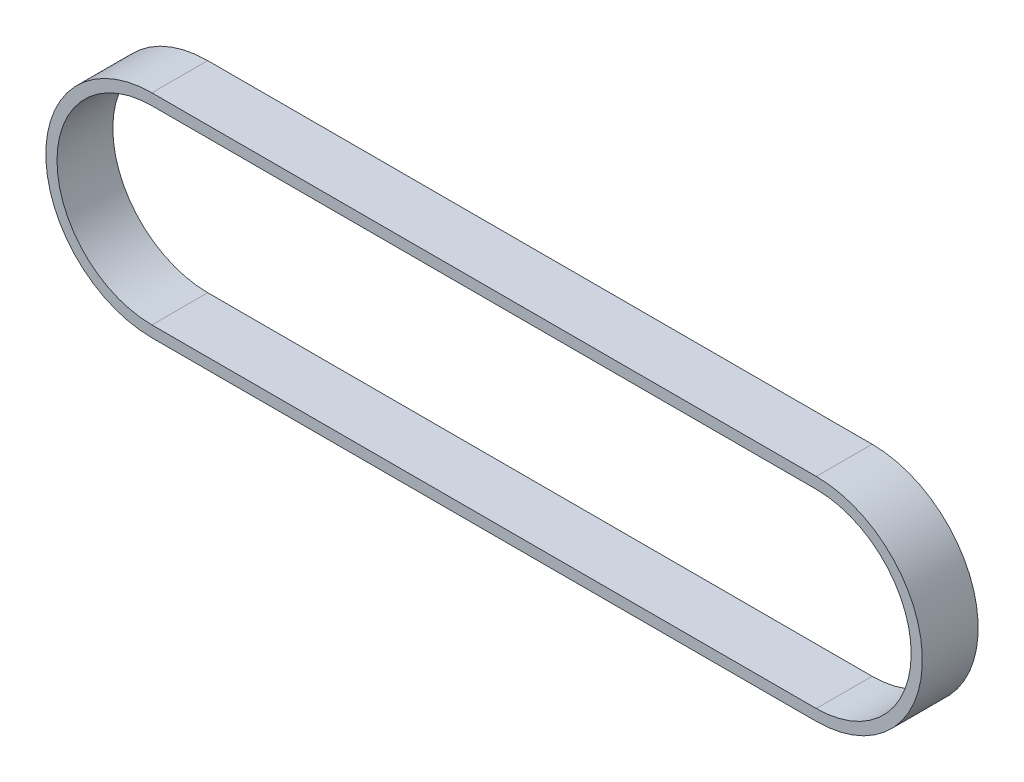
ISO-10303-21;
HEADER;
FILE_DESCRIPTION(('STEP AP214'),'2;1');
FILE_NAME('part.step','',(''),(''),'','','');
FILE_SCHEMA(('AUTOMOTIVE_DESIGN { 1 0 10303 214 1 1 1 1 }'));
ENDSEC;
DATA;
#1=APPLICATION_CONTEXT('core data for automotive mechanical design processes');
#2=APPLICATION_PROTOCOL_DEFINITION('international standard','automotive_design',2000,#1);
#3=PRODUCT_CONTEXT('',#1,'mechanical');
#4=PRODUCT('Part','Part','',(#3));
#5=PRODUCT_RELATED_PRODUCT_CATEGORY('part','',(#4));
#6=PRODUCT_DEFINITION_FORMATION('','',#4);
#7=PRODUCT_DEFINITION_CONTEXT('part definition',#1,'design');
#8=PRODUCT_DEFINITION('design','',#6,#7);
#9=PRODUCT_DEFINITION_SHAPE('','',#8);
#10=(LENGTH_UNIT() NAMED_UNIT(*) SI_UNIT(.MILLI.,.METRE.));
#11=(NAMED_UNIT(*) PLANE_ANGLE_UNIT() SI_UNIT($,.RADIAN.));
#12=(NAMED_UNIT(*) SI_UNIT($,.STERADIAN.) SOLID_ANGLE_UNIT());
#13=UNCERTAINTY_MEASURE_WITH_UNIT(LENGTH_MEASURE(1.E-05),#10,'distance_accuracy_value','');
#14=(GEOMETRIC_REPRESENTATION_CONTEXT(3) GLOBAL_UNCERTAINTY_ASSIGNED_CONTEXT((#13)) GLOBAL_UNIT_ASSIGNED_CONTEXT((#10,
#11,#12)) REPRESENTATION_CONTEXT('',''));
#15=CARTESIAN_POINT('',(0.,0.,0.));
#16=DIRECTION('',(0.,0.,1.));
#17=DIRECTION('',(1.,0.,0.));
#18=AXIS2_PLACEMENT_3D('',#15,#16,#17);
#19=CARTESIAN_POINT('',(-15.1421800947867,0.,5.));
#20=DIRECTION('',(0.,0.,1.));
#21=DIRECTION('',(1.,0.,0.));
#22=AXIS2_PLACEMENT_3D('',#19,#20,#21);
#23=PLANE('',#22);
#24=CARTESIAN_POINT('',(-15.1421800947867,0.,5.));
#25=DIRECTION('',(0.,0.,1.));
#26=DIRECTION('',(1.,0.,0.));
#27=AXIS2_PLACEMENT_3D('',#24,#25,#26);
#28=CIRCLE('',#27,19.);
#29=CARTESIAN_POINT('',(-15.1421800947867,19.,5.));
#30=VERTEX_POINT('',#29);
#31=CARTESIAN_POINT('',(-15.1421800947867,-19.,5.));
#32=VERTEX_POINT('',#31);
#33=EDGE_CURVE('E164',#30,#32,#28,.T.);
#34=ORIENTED_EDGE('',*,*,#33,.T.);
#35=DIRECTION('',(1.,0.,0.));
#36=VECTOR('',#35,1.);
#37=CARTESIAN_POINT('',(-15.1421800947867,-19.,5.));
#38=LINE('',#37,#36);
#39=CARTESIAN_POINT('',(103.857819905213,-19.,5.));
#40=VERTEX_POINT('',#39);
#41=EDGE_CURVE('E167',#32,#40,#38,.T.);
#42=ORIENTED_EDGE('',*,*,#41,.T.);
#43=CARTESIAN_POINT('',(103.857819905213,0.,5.));
#44=DIRECTION('',(0.,0.,1.));
#45=DIRECTION('',(1.,0.,0.));
#46=AXIS2_PLACEMENT_3D('',#43,#44,#45);
#47=CIRCLE('',#46,19.);
#48=CARTESIAN_POINT('',(103.857819905213,19.,5.));
#49=VERTEX_POINT('',#48);
#50=EDGE_CURVE('E170',#40,#49,#47,.T.);
#51=ORIENTED_EDGE('',*,*,#50,.T.);
#52=DIRECTION('',(-1.,0.,0.));
#53=VECTOR('',#52,1.);
#54=CARTESIAN_POINT('',(-15.1421800947867,19.,5.));
#55=LINE('',#54,#53);
#56=EDGE_CURVE('E172',#49,#30,#55,.T.);
#57=ORIENTED_EDGE('',*,*,#56,.T.);
#58=EDGE_LOOP('',(#34,#42,#51,#57));
#59=FACE_BOUND('',#58,.T.);
#60=DIRECTION('',(1.,0.,0.));
#61=VECTOR('',#60,1.);
#62=CARTESIAN_POINT('',(-15.1421800947867,-17.,5.));
#63=LINE('',#62,#61);
#64=CARTESIAN_POINT('',(-15.1421800947867,-17.,5.));
#65=VERTEX_POINT('',#64);
#66=CARTESIAN_POINT('',(103.857819905213,-17.,5.));
#67=VERTEX_POINT('',#66);
#68=EDGE_CURVE('E136',#65,#67,#63,.T.);
#69=ORIENTED_EDGE('',*,*,#68,.F.);
#70=CARTESIAN_POINT('',(-15.1421800947867,0.,5.));
#71=DIRECTION('',(0.,0.,1.));
#72=DIRECTION('',(1.,0.,0.));
#73=AXIS2_PLACEMENT_3D('',#70,#71,#72);
#74=CIRCLE('',#73,17.);
#75=CARTESIAN_POINT('',(-15.1421800947867,17.,5.));
#76=VERTEX_POINT('',#75);
#77=EDGE_CURVE('E128',#76,#65,#74,.T.);
#78=ORIENTED_EDGE('',*,*,#77,.F.);
#79=DIRECTION('',(-1.,0.,0.));
#80=VECTOR('',#79,1.);
#81=CARTESIAN_POINT('',(-15.1421800947867,17.,5.));
#82=LINE('',#81,#80);
#83=CARTESIAN_POINT('',(103.857819905213,17.,5.));
#84=VERTEX_POINT('',#83);
#85=EDGE_CURVE('E150',#84,#76,#82,.T.);
#86=ORIENTED_EDGE('',*,*,#85,.F.);
#87=CARTESIAN_POINT('',(103.857819905213,0.,5.));
#88=DIRECTION('',(0.,0.,1.));
#89=DIRECTION('',(1.,0.,0.));
#90=AXIS2_PLACEMENT_3D('',#87,#88,#89);
#91=CIRCLE('',#90,17.);
#92=EDGE_CURVE('E148',#67,#84,#91,.T.);
#93=ORIENTED_EDGE('',*,*,#92,.F.);
#94=EDGE_LOOP('',(#69,#78,#86,#93));
#95=FACE_BOUND('',#94,.T.);
#96=ADVANCED_FACE('F63',(#59,#95),#23,.T.);
#97=CARTESIAN_POINT('',(-15.1421800947867,0.,-5.));
#98=DIRECTION('',(0.,0.,1.));
#99=DIRECTION('',(1.,0.,0.));
#100=AXIS2_PLACEMENT_3D('',#97,#98,#99);
#101=PLANE('',#100);
#102=CARTESIAN_POINT('',(-15.1421800947867,0.,-5.));
#103=DIRECTION('',(0.,0.,1.));
#104=DIRECTION('',(1.,0.,0.));
#105=AXIS2_PLACEMENT_3D('',#102,#103,#104);
#106=CIRCLE('',#105,19.);
#107=CARTESIAN_POINT('',(-15.1421800947867,19.,-5.));
#108=VERTEX_POINT('',#107);
#109=CARTESIAN_POINT('',(-15.1421800947867,-19.,-5.));
#110=VERTEX_POINT('',#109);
#111=EDGE_CURVE('E144',#108,#110,#106,.T.);
#112=ORIENTED_EDGE('',*,*,#111,.F.);
#113=DIRECTION('',(-1.,0.,0.));
#114=VECTOR('',#113,1.);
#115=CARTESIAN_POINT('',(-15.1421800947867,19.,-5.));
#116=LINE('',#115,#114);
#117=CARTESIAN_POINT('',(103.857819905213,19.,-5.));
#118=VERTEX_POINT('',#117);
#119=EDGE_CURVE('E168',#118,#108,#116,.T.);
#120=ORIENTED_EDGE('',*,*,#119,.F.);
#121=CARTESIAN_POINT('',(103.857819905213,0.,-5.));
#122=DIRECTION('',(0.,0.,1.));
#123=DIRECTION('',(1.,0.,0.));
#124=AXIS2_PLACEMENT_3D('',#121,#122,#123);
#125=CIRCLE('',#124,19.);
#126=CARTESIAN_POINT('',(103.857819905213,-19.,-5.));
#127=VERTEX_POINT('',#126);
#128=EDGE_CURVE('E179',#127,#118,#125,.T.);
#129=ORIENTED_EDGE('',*,*,#128,.F.);
#130=DIRECTION('',(1.,0.,0.));
#131=VECTOR('',#130,1.);
#132=CARTESIAN_POINT('',(-15.1421800947867,-19.,-5.));
#133=LINE('',#132,#131);
#134=EDGE_CURVE('E177',#110,#127,#133,.T.);
#135=ORIENTED_EDGE('',*,*,#134,.F.);
#136=EDGE_LOOP('',(#112,#120,#129,#135));
#137=FACE_BOUND('',#136,.T.);
#138=CARTESIAN_POINT('',(-15.1421800947867,0.,-5.));
#139=DIRECTION('',(0.,0.,1.));
#140=DIRECTION('',(1.,0.,0.));
#141=AXIS2_PLACEMENT_3D('',#138,#139,#140);
#142=CIRCLE('',#141,17.);
#143=CARTESIAN_POINT('',(-15.1421800947867,17.,-5.));
#144=VERTEX_POINT('',#143);
#145=CARTESIAN_POINT('',(-15.1421800947867,-17.,-5.));
#146=VERTEX_POINT('',#145);
#147=EDGE_CURVE('E86',#144,#146,#142,.T.);
#148=ORIENTED_EDGE('',*,*,#147,.T.);
#149=DIRECTION('',(1.,0.,0.));
#150=VECTOR('',#149,1.);
#151=CARTESIAN_POINT('',(-15.1421800947867,-17.,-5.));
#152=LINE('',#151,#150);
#153=CARTESIAN_POINT('',(103.857819905213,-17.,-5.));
#154=VERTEX_POINT('',#153);
#155=EDGE_CURVE('E143',#146,#154,#152,.T.);
#156=ORIENTED_EDGE('',*,*,#155,.T.);
#157=CARTESIAN_POINT('',(103.857819905213,0.,-5.));
#158=DIRECTION('',(0.,0.,1.));
#159=DIRECTION('',(1.,0.,0.));
#160=AXIS2_PLACEMENT_3D('',#157,#158,#159);
#161=CIRCLE('',#160,17.);
#162=CARTESIAN_POINT('',(103.857819905213,17.,-5.));
#163=VERTEX_POINT('',#162);
#164=EDGE_CURVE('E156',#154,#163,#161,.T.);
#165=ORIENTED_EDGE('',*,*,#164,.T.);
#166=DIRECTION('',(-1.,0.,0.));
#167=VECTOR('',#166,1.);
#168=CARTESIAN_POINT('',(-15.1421800947867,17.,-5.));
#169=LINE('',#168,#167);
#170=EDGE_CURVE('E137',#163,#144,#169,.T.);
#171=ORIENTED_EDGE('',*,*,#170,.T.);
#172=EDGE_LOOP('',(#148,#156,#165,#171));
#173=FACE_BOUND('',#172,.T.);
#174=ADVANCED_FACE('F197',(#137,#173),#101,.F.);
#175=CARTESIAN_POINT('',(-15.1421800947867,0.,5.));
#176=DIRECTION('',(0.,0.,-1.));
#177=DIRECTION('',(-1.,0.,0.));
#178=AXIS2_PLACEMENT_3D('',#175,#176,#177);
#179=CYLINDRICAL_SURFACE('',#178,19.);
#180=ORIENTED_EDGE('',*,*,#111,.T.);
#181=DIRECTION('',(0.,0.,-1.));
#182=VECTOR('',#181,1.);
#183=CARTESIAN_POINT('',(-15.1421800947867,-19.,5.));
#184=LINE('',#183,#182);
#185=EDGE_CURVE('E12',#32,#110,#184,.T.);
#186=ORIENTED_EDGE('',*,*,#185,.F.);
#187=ORIENTED_EDGE('',*,*,#33,.F.);
#188=DIRECTION('',(0.,0.,-1.));
#189=VECTOR('',#188,1.);
#190=CARTESIAN_POINT('',(-15.1421800947867,19.,5.));
#191=LINE('',#190,#189);
#192=EDGE_CURVE('E174',#30,#108,#191,.T.);
#193=ORIENTED_EDGE('',*,*,#192,.T.);
#194=EDGE_LOOP('',(#180,#186,#187,#193));
#195=FACE_BOUND('',#194,.T.);
#196=ADVANCED_FACE('F65',(#195),#179,.T.);
#197=CARTESIAN_POINT('',(-15.1421800947867,-19.,5.));
#198=DIRECTION('',(0.,1.,0.));
#199=DIRECTION('',(0.,0.,1.));
#200=AXIS2_PLACEMENT_3D('',#197,#198,#199);
#201=PLANE('',#200);
#202=ORIENTED_EDGE('',*,*,#134,.T.);
#203=DIRECTION('',(0.,0.,-1.));
#204=VECTOR('',#203,1.);
#205=CARTESIAN_POINT('',(103.857819905213,-19.,5.));
#206=LINE('',#205,#204);
#207=EDGE_CURVE('E71',#40,#127,#206,.T.);
#208=ORIENTED_EDGE('',*,*,#207,.F.);
#209=ORIENTED_EDGE('',*,*,#41,.F.);
#210=ORIENTED_EDGE('',*,*,#185,.T.);
#211=EDGE_LOOP('',(#202,#208,#209,#210));
#212=FACE_BOUND('',#211,.T.);
#213=ADVANCED_FACE('F207',(#212),#201,.F.);
#214=CARTESIAN_POINT('',(103.857819905213,0.,5.));
#215=DIRECTION('',(0.,0.,-1.));
#216=DIRECTION('',(-1.,0.,0.));
#217=AXIS2_PLACEMENT_3D('',#214,#215,#216);
#218=CYLINDRICAL_SURFACE('',#217,19.);
#219=ORIENTED_EDGE('',*,*,#128,.T.);
#220=DIRECTION('',(0.,0.,-1.));
#221=VECTOR('',#220,1.);
#222=CARTESIAN_POINT('',(103.857819905213,19.,5.));
#223=LINE('',#222,#221);
#224=EDGE_CURVE('E184',#49,#118,#223,.T.);
#225=ORIENTED_EDGE('',*,*,#224,.F.);
#226=ORIENTED_EDGE('',*,*,#50,.F.);
#227=ORIENTED_EDGE('',*,*,#207,.T.);
#228=EDGE_LOOP('',(#219,#225,#226,#227));
#229=FACE_BOUND('',#228,.T.);
#230=ADVANCED_FACE('F191',(#229),#218,.T.);
#231=CARTESIAN_POINT('',(-15.1421800947867,19.,5.));
#232=DIRECTION('',(0.,-1.,0.));
#233=DIRECTION('',(0.,0.,-1.));
#234=AXIS2_PLACEMENT_3D('',#231,#232,#233);
#235=PLANE('',#234);
#236=ORIENTED_EDGE('',*,*,#119,.T.);
#237=ORIENTED_EDGE('',*,*,#192,.F.);
#238=ORIENTED_EDGE('',*,*,#56,.F.);
#239=ORIENTED_EDGE('',*,*,#224,.T.);
#240=EDGE_LOOP('',(#236,#237,#238,#239));
#241=FACE_BOUND('',#240,.T.);
#242=ADVANCED_FACE('F201',(#241),#235,.F.);
#243=CARTESIAN_POINT('',(-15.1421800947867,0.,5.));
#244=DIRECTION('',(0.,0.,-1.));
#245=DIRECTION('',(-1.,0.,0.));
#246=AXIS2_PLACEMENT_3D('',#243,#244,#245);
#247=CYLINDRICAL_SURFACE('',#246,17.);
#248=ORIENTED_EDGE('',*,*,#147,.F.);
#249=DIRECTION('',(0.,0.,-1.));
#250=VECTOR('',#249,1.);
#251=CARTESIAN_POINT('',(-15.1421800947867,17.,5.));
#252=LINE('',#251,#250);
#253=EDGE_CURVE('E132',#76,#144,#252,.T.);
#254=ORIENTED_EDGE('',*,*,#253,.F.);
#255=ORIENTED_EDGE('',*,*,#77,.T.);
#256=DIRECTION('',(0.,0.,-1.));
#257=VECTOR('',#256,1.);
#258=CARTESIAN_POINT('',(-15.1421800947867,-17.,5.));
#259=LINE('',#258,#257);
#260=EDGE_CURVE('E131',#65,#146,#259,.T.);
#261=ORIENTED_EDGE('',*,*,#260,.T.);
#262=EDGE_LOOP('',(#248,#254,#255,#261));
#263=FACE_BOUND('',#262,.T.);
#264=ADVANCED_FACE('F130',(#263),#247,.F.);
#265=CARTESIAN_POINT('',(-15.1421800947867,-17.,5.));
#266=DIRECTION('',(0.,1.,0.));
#267=DIRECTION('',(0.,0.,1.));
#268=AXIS2_PLACEMENT_3D('',#265,#266,#267);
#269=PLANE('',#268);
#270=ORIENTED_EDGE('',*,*,#155,.F.);
#271=ORIENTED_EDGE('',*,*,#260,.F.);
#272=ORIENTED_EDGE('',*,*,#68,.T.);
#273=DIRECTION('',(0.,0.,-1.));
#274=VECTOR('',#273,1.);
#275=CARTESIAN_POINT('',(103.857819905213,-17.,5.));
#276=LINE('',#275,#274);
#277=EDGE_CURVE('E145',#67,#154,#276,.T.);
#278=ORIENTED_EDGE('',*,*,#277,.T.);
#279=EDGE_LOOP('',(#270,#271,#272,#278));
#280=FACE_BOUND('',#279,.T.);
#281=ADVANCED_FACE('F140',(#280),#269,.T.);
#282=CARTESIAN_POINT('',(103.857819905213,0.,5.));
#283=DIRECTION('',(0.,0.,-1.));
#284=DIRECTION('',(-1.,0.,0.));
#285=AXIS2_PLACEMENT_3D('',#282,#283,#284);
#286=CYLINDRICAL_SURFACE('',#285,17.);
#287=ORIENTED_EDGE('',*,*,#164,.F.);
#288=ORIENTED_EDGE('',*,*,#277,.F.);
#289=ORIENTED_EDGE('',*,*,#92,.T.);
#290=DIRECTION('',(0.,0.,-1.));
#291=VECTOR('',#290,1.);
#292=CARTESIAN_POINT('',(103.857819905213,17.,5.));
#293=LINE('',#292,#291);
#294=EDGE_CURVE('E78',#84,#163,#293,.T.);
#295=ORIENTED_EDGE('',*,*,#294,.T.);
#296=EDGE_LOOP('',(#287,#288,#289,#295));
#297=FACE_BOUND('',#296,.T.);
#298=ADVANCED_FACE('F230',(#297),#286,.F.);
#299=CARTESIAN_POINT('',(-15.1421800947867,17.,5.));
#300=DIRECTION('',(0.,-1.,0.));
#301=DIRECTION('',(0.,0.,-1.));
#302=AXIS2_PLACEMENT_3D('',#299,#300,#301);
#303=PLANE('',#302);
#304=ORIENTED_EDGE('',*,*,#170,.F.);
#305=ORIENTED_EDGE('',*,*,#294,.F.);
#306=ORIENTED_EDGE('',*,*,#85,.T.);
#307=ORIENTED_EDGE('',*,*,#253,.T.);
#308=EDGE_LOOP('',(#304,#305,#306,#307));
#309=FACE_BOUND('',#308,.T.);
#310=ADVANCED_FACE('F234',(#309),#303,.T.);
#311=CLOSED_SHELL('',(#96,#174,#196,#213,#230,#242,#264,#281,#298,#310));
#312=MANIFOLD_SOLID_BREP('B2',#311);
#313=ADVANCED_BREP_SHAPE_REPRESENTATION('',(#18,#312),#14);
#314=SHAPE_DEFINITION_REPRESENTATION(#9,#313);
ENDSEC;
END-ISO-10303-21;
